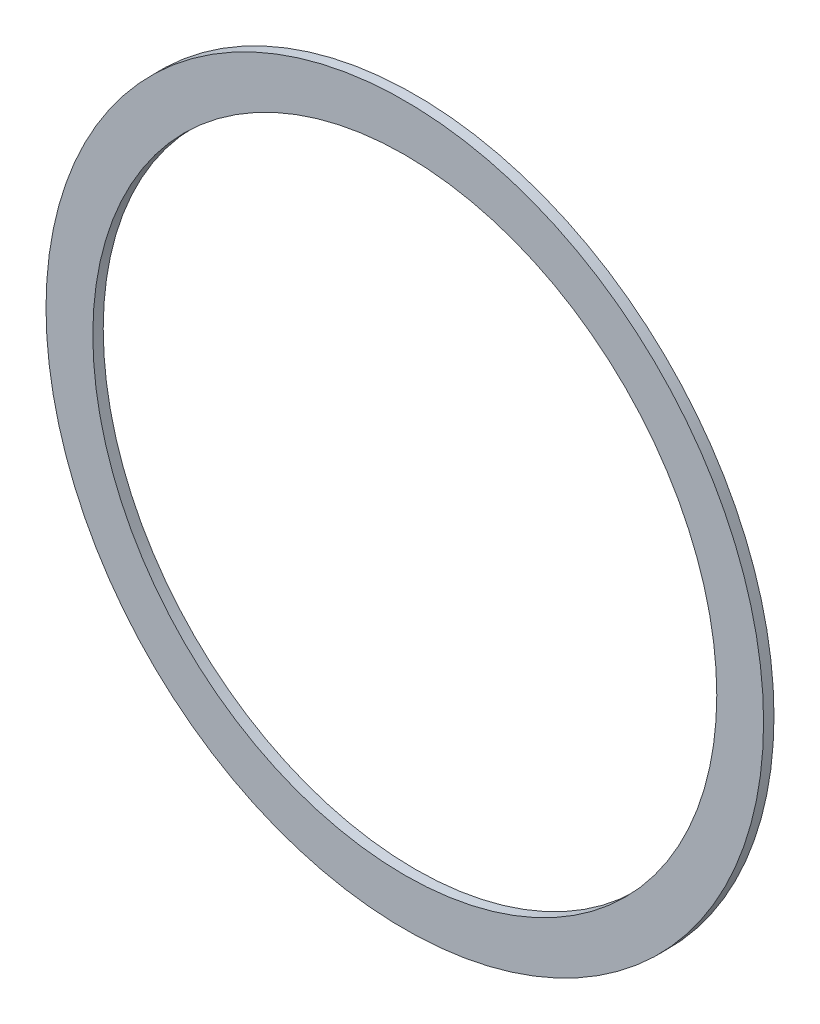
ISO-10303-21;
HEADER;
FILE_DESCRIPTION(('STEP AP214'),'2;1');
FILE_NAME('part.step','',(''),(''),'','','');
FILE_SCHEMA(('AUTOMOTIVE_DESIGN { 1 0 10303 214 1 1 1 1 }'));
ENDSEC;
DATA;
#1=APPLICATION_CONTEXT('core data for automotive mechanical design processes');
#2=APPLICATION_PROTOCOL_DEFINITION('international standard','automotive_design',2000,#1);
#3=PRODUCT_CONTEXT('',#1,'mechanical');
#4=PRODUCT('Part','Part','',(#3));
#5=PRODUCT_RELATED_PRODUCT_CATEGORY('part','',(#4));
#6=PRODUCT_DEFINITION_FORMATION('','',#4);
#7=PRODUCT_DEFINITION_CONTEXT('part definition',#1,'design');
#8=PRODUCT_DEFINITION('design','',#6,#7);
#9=PRODUCT_DEFINITION_SHAPE('','',#8);
#10=(LENGTH_UNIT() NAMED_UNIT(*) SI_UNIT(.MILLI.,.METRE.));
#11=(NAMED_UNIT(*) PLANE_ANGLE_UNIT() SI_UNIT($,.RADIAN.));
#12=(NAMED_UNIT(*) SI_UNIT($,.STERADIAN.) SOLID_ANGLE_UNIT());
#13=UNCERTAINTY_MEASURE_WITH_UNIT(LENGTH_MEASURE(1.E-05),#10,'distance_accuracy_value','');
#14=(GEOMETRIC_REPRESENTATION_CONTEXT(3) GLOBAL_UNCERTAINTY_ASSIGNED_CONTEXT((#13)) GLOBAL_UNIT_ASSIGNED_CONTEXT((#10,
#11,#12)) REPRESENTATION_CONTEXT('',''));
#15=CARTESIAN_POINT('',(0.,0.,0.));
#16=DIRECTION('',(0.,0.,1.));
#17=DIRECTION('',(1.,0.,0.));
#18=AXIS2_PLACEMENT_3D('',#15,#16,#17);
#19=CARTESIAN_POINT('',(0.,0.,2.));
#20=DIRECTION('',(0.,0.,1.));
#21=DIRECTION('',(1.,0.,0.));
#22=AXIS2_PLACEMENT_3D('',#19,#20,#21);
#23=PLANE('',#22);
#24=CARTESIAN_POINT('',(0.,0.,2.));
#25=DIRECTION('',(0.,0.,1.));
#26=DIRECTION('',(1.,0.,0.));
#27=AXIS2_PLACEMENT_3D('',#24,#25,#26);
#28=CIRCLE('',#27,69.);
#29=CARTESIAN_POINT('',(69.,0.,2.));
#30=VERTEX_POINT('',#29);
#31=EDGE_CURVE('E10',#30,#30,#28,.T.);
#32=ORIENTED_EDGE('',*,*,#31,.T.);
#33=EDGE_LOOP('',(#32));
#34=FACE_BOUND('',#33,.T.);
#35=CARTESIAN_POINT('',(0.,0.,2.));
#36=DIRECTION('',(0.,0.,1.));
#37=DIRECTION('',(1.,0.,0.));
#38=AXIS2_PLACEMENT_3D('',#35,#36,#37);
#39=CIRCLE('',#38,60.);
#40=CARTESIAN_POINT('',(60.,0.,2.));
#41=VERTEX_POINT('',#40);
#42=EDGE_CURVE('E41',#41,#41,#39,.T.);
#43=ORIENTED_EDGE('',*,*,#42,.F.);
#44=EDGE_LOOP('',(#43));
#45=FACE_BOUND('',#44,.T.);
#46=ADVANCED_FACE('F30',(#34,#45),#23,.T.);
#47=CARTESIAN_POINT('',(0.,0.,0.));
#48=DIRECTION('',(0.,0.,1.));
#49=DIRECTION('',(1.,0.,0.));
#50=AXIS2_PLACEMENT_3D('',#47,#48,#49);
#51=PLANE('',#50);
#52=CARTESIAN_POINT('',(0.,0.,0.));
#53=DIRECTION('',(0.,0.,1.));
#54=DIRECTION('',(1.,0.,0.));
#55=AXIS2_PLACEMENT_3D('',#52,#53,#54);
#56=CIRCLE('',#55,69.);
#57=CARTESIAN_POINT('',(69.,0.,0.));
#58=VERTEX_POINT('',#57);
#59=EDGE_CURVE('E34',#58,#58,#56,.T.);
#60=ORIENTED_EDGE('',*,*,#59,.F.);
#61=EDGE_LOOP('',(#60));
#62=FACE_BOUND('',#61,.T.);
#63=CARTESIAN_POINT('',(0.,0.,0.));
#64=DIRECTION('',(0.,0.,1.));
#65=DIRECTION('',(1.,0.,0.));
#66=AXIS2_PLACEMENT_3D('',#63,#64,#65);
#67=CIRCLE('',#66,60.);
#68=CARTESIAN_POINT('',(60.,0.,0.));
#69=VERTEX_POINT('',#68);
#70=EDGE_CURVE('E43',#69,#69,#67,.T.);
#71=ORIENTED_EDGE('',*,*,#70,.T.);
#72=EDGE_LOOP('',(#71));
#73=FACE_BOUND('',#72,.T.);
#74=ADVANCED_FACE('F53',(#62,#73),#51,.F.);
#75=CARTESIAN_POINT('',(0.,0.,2.));
#76=DIRECTION('',(0.,0.,-1.));
#77=DIRECTION('',(-1.,0.,0.));
#78=AXIS2_PLACEMENT_3D('',#75,#76,#77);
#79=CYLINDRICAL_SURFACE('',#78,69.);
#80=ORIENTED_EDGE('',*,*,#31,.F.);
#81=EDGE_LOOP('',(#80));
#82=FACE_BOUND('',#81,.T.);
#83=ORIENTED_EDGE('',*,*,#59,.T.);
#84=EDGE_LOOP('',(#83));
#85=FACE_BOUND('',#84,.T.);
#86=ADVANCED_FACE('F32',(#82,#85),#79,.T.);
#87=CARTESIAN_POINT('',(0.,0.,2.));
#88=DIRECTION('',(0.,0.,-1.));
#89=DIRECTION('',(-1.,0.,0.));
#90=AXIS2_PLACEMENT_3D('',#87,#88,#89);
#91=CYLINDRICAL_SURFACE('',#90,60.);
#92=ORIENTED_EDGE('',*,*,#42,.T.);
#93=EDGE_LOOP('',(#92));
#94=FACE_BOUND('',#93,.T.);
#95=ORIENTED_EDGE('',*,*,#70,.F.);
#96=EDGE_LOOP('',(#95));
#97=FACE_BOUND('',#96,.T.);
#98=ADVANCED_FACE('F49',(#94,#97),#91,.F.);
#99=CLOSED_SHELL('',(#46,#74,#86,#98));
#100=MANIFOLD_SOLID_BREP('B2',#99);
#101=ADVANCED_BREP_SHAPE_REPRESENTATION('',(#18,#100),#14);
#102=SHAPE_DEFINITION_REPRESENTATION(#9,#101);
ENDSEC;
END-ISO-10303-21;
